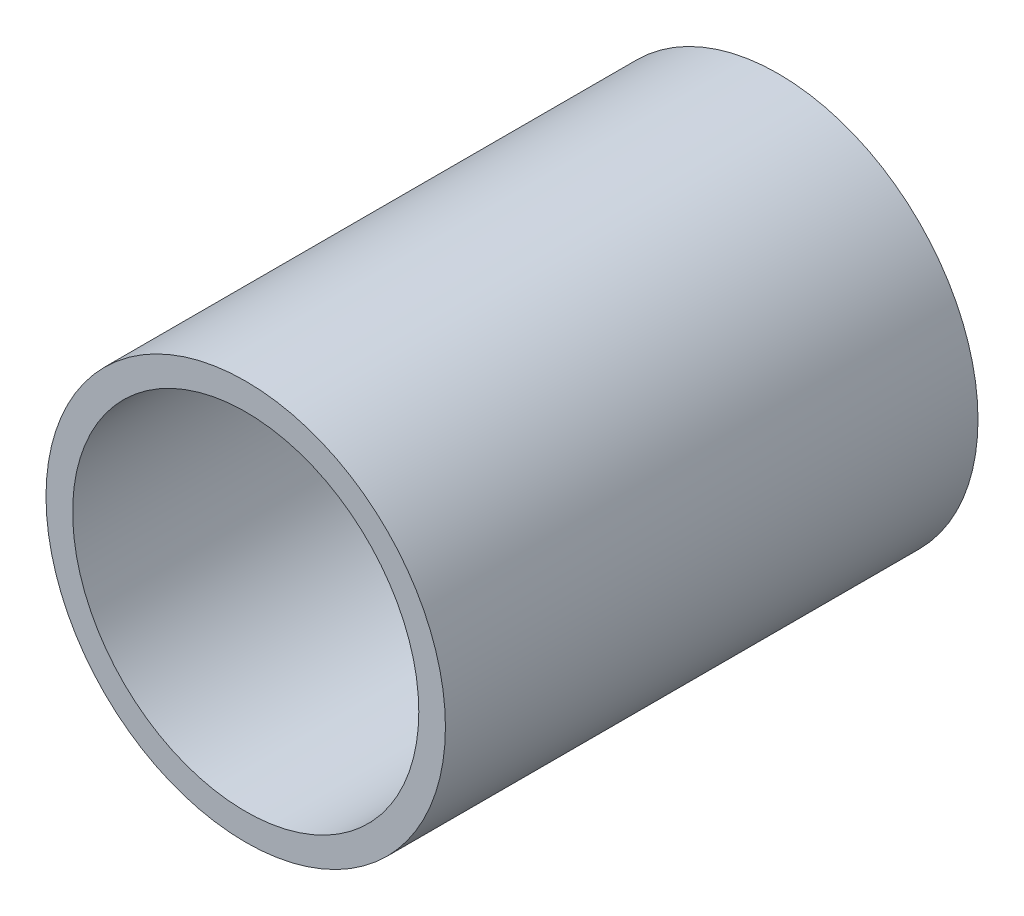
ISO-10303-21;
HEADER;
FILE_DESCRIPTION(('STEP AP214'),'2;1');
FILE_NAME('part.step','',(''),(''),'','','');
FILE_SCHEMA(('AUTOMOTIVE_DESIGN { 1 0 10303 214 1 1 1 1 }'));
ENDSEC;
DATA;
#1=APPLICATION_CONTEXT('core data for automotive mechanical design processes');
#2=APPLICATION_PROTOCOL_DEFINITION('international standard','automotive_design',2000,#1);
#3=PRODUCT_CONTEXT('',#1,'mechanical');
#4=PRODUCT('Part','Part','',(#3));
#5=PRODUCT_RELATED_PRODUCT_CATEGORY('part','',(#4));
#6=PRODUCT_DEFINITION_FORMATION('','',#4);
#7=PRODUCT_DEFINITION_CONTEXT('part definition',#1,'design');
#8=PRODUCT_DEFINITION('design','',#6,#7);
#9=PRODUCT_DEFINITION_SHAPE('','',#8);
#10=(LENGTH_UNIT() NAMED_UNIT(*) SI_UNIT(.MILLI.,.METRE.));
#11=(NAMED_UNIT(*) PLANE_ANGLE_UNIT() SI_UNIT($,.RADIAN.));
#12=(NAMED_UNIT(*) SI_UNIT($,.STERADIAN.) SOLID_ANGLE_UNIT());
#13=UNCERTAINTY_MEASURE_WITH_UNIT(LENGTH_MEASURE(1.E-05),#10,'distance_accuracy_value','');
#14=(GEOMETRIC_REPRESENTATION_CONTEXT(3) GLOBAL_UNCERTAINTY_ASSIGNED_CONTEXT((#13)) GLOBAL_UNIT_ASSIGNED_CONTEXT((#10,
#11,#12)) REPRESENTATION_CONTEXT('',''));
#15=CARTESIAN_POINT('',(0.,0.,0.));
#16=DIRECTION('',(0.,0.,1.));
#17=DIRECTION('',(1.,0.,0.));
#18=AXIS2_PLACEMENT_3D('',#15,#16,#17);
#19=CARTESIAN_POINT('',(0.,0.,20.));
#20=DIRECTION('',(0.,0.,1.));
#21=DIRECTION('',(1.,0.,0.));
#22=AXIS2_PLACEMENT_3D('',#19,#20,#21);
#23=PLANE('',#22);
#24=CARTESIAN_POINT('',(0.,0.,20.));
#25=DIRECTION('',(0.,0.,1.));
#26=DIRECTION('',(1.,0.,0.));
#27=AXIS2_PLACEMENT_3D('',#24,#25,#26);
#28=CIRCLE('',#27,7.5);
#29=CARTESIAN_POINT('',(7.5,0.,20.));
#30=VERTEX_POINT('',#29);
#31=EDGE_CURVE('E10',#30,#30,#28,.T.);
#32=ORIENTED_EDGE('',*,*,#31,.T.);
#33=EDGE_LOOP('',(#32));
#34=FACE_BOUND('',#33,.T.);
#35=CARTESIAN_POINT('',(0.,0.,20.));
#36=DIRECTION('',(0.,0.,1.));
#37=DIRECTION('',(1.,0.,0.));
#38=AXIS2_PLACEMENT_3D('',#35,#36,#37);
#39=CIRCLE('',#38,6.5);
#40=CARTESIAN_POINT('',(6.5,0.,20.));
#41=VERTEX_POINT('',#40);
#42=EDGE_CURVE('E42',#41,#41,#39,.T.);
#43=ORIENTED_EDGE('',*,*,#42,.F.);
#44=EDGE_LOOP('',(#43));
#45=FACE_BOUND('',#44,.T.);
#46=ADVANCED_FACE('F31',(#34,#45),#23,.T.);
#47=CARTESIAN_POINT('',(0.,0.,0.));
#48=DIRECTION('',(0.,0.,1.));
#49=DIRECTION('',(1.,0.,0.));
#50=AXIS2_PLACEMENT_3D('',#47,#48,#49);
#51=PLANE('',#50);
#52=CARTESIAN_POINT('',(0.,0.,0.));
#53=DIRECTION('',(0.,0.,1.));
#54=DIRECTION('',(1.,0.,0.));
#55=AXIS2_PLACEMENT_3D('',#52,#53,#54);
#56=CIRCLE('',#55,7.5);
#57=CARTESIAN_POINT('',(7.5,0.,0.));
#58=VERTEX_POINT('',#57);
#59=EDGE_CURVE('E35',#58,#58,#56,.T.);
#60=ORIENTED_EDGE('',*,*,#59,.F.);
#61=EDGE_LOOP('',(#60));
#62=FACE_BOUND('',#61,.T.);
#63=CARTESIAN_POINT('',(0.,0.,0.));
#64=DIRECTION('',(0.,0.,1.));
#65=DIRECTION('',(1.,0.,0.));
#66=AXIS2_PLACEMENT_3D('',#63,#64,#65);
#67=CIRCLE('',#66,6.5);
#68=CARTESIAN_POINT('',(6.5,0.,0.));
#69=VERTEX_POINT('',#68);
#70=EDGE_CURVE('E44',#69,#69,#67,.T.);
#71=ORIENTED_EDGE('',*,*,#70,.T.);
#72=EDGE_LOOP('',(#71));
#73=FACE_BOUND('',#72,.T.);
#74=ADVANCED_FACE('F54',(#62,#73),#51,.F.);
#75=CARTESIAN_POINT('',(0.,0.,20.));
#76=DIRECTION('',(0.,0.,-1.));
#77=DIRECTION('',(-1.,0.,0.));
#78=AXIS2_PLACEMENT_3D('',#75,#76,#77);
#79=CYLINDRICAL_SURFACE('',#78,7.5);
#80=ORIENTED_EDGE('',*,*,#31,.F.);
#81=EDGE_LOOP('',(#80));
#82=FACE_BOUND('',#81,.T.);
#83=ORIENTED_EDGE('',*,*,#59,.T.);
#84=EDGE_LOOP('',(#83));
#85=FACE_BOUND('',#84,.T.);
#86=ADVANCED_FACE('F33',(#82,#85),#79,.T.);
#87=CARTESIAN_POINT('',(0.,0.,20.));
#88=DIRECTION('',(0.,0.,-1.));
#89=DIRECTION('',(-1.,0.,0.));
#90=AXIS2_PLACEMENT_3D('',#87,#88,#89);
#91=CYLINDRICAL_SURFACE('',#90,6.5);
#92=ORIENTED_EDGE('',*,*,#42,.T.);
#93=EDGE_LOOP('',(#92));
#94=FACE_BOUND('',#93,.T.);
#95=ORIENTED_EDGE('',*,*,#70,.F.);
#96=EDGE_LOOP('',(#95));
#97=FACE_BOUND('',#96,.T.);
#98=ADVANCED_FACE('F50',(#94,#97),#91,.F.);
#99=CLOSED_SHELL('',(#46,#74,#86,#98));
#100=MANIFOLD_SOLID_BREP('B2',#99);
#101=ADVANCED_BREP_SHAPE_REPRESENTATION('',(#18,#100),#14);
#102=SHAPE_DEFINITION_REPRESENTATION(#9,#101);
ENDSEC;
END-ISO-10303-21;
